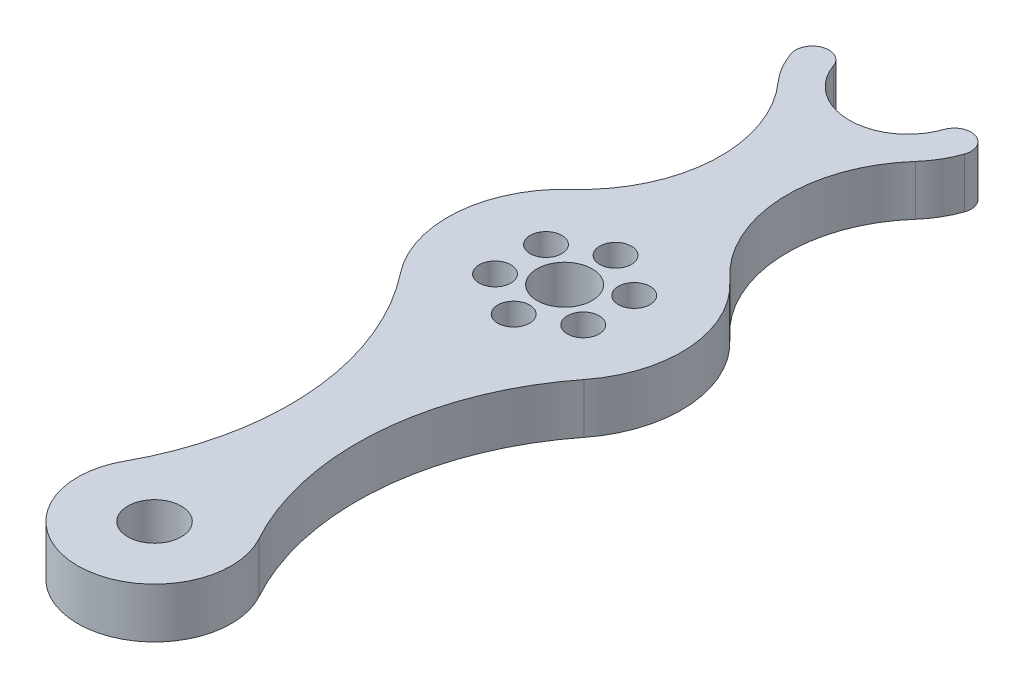
ISO-10303-21;
HEADER;
FILE_DESCRIPTION(('STEP AP214'),'2;1');
FILE_NAME('part.step','',(''),(''),'','','');
FILE_SCHEMA(('AUTOMOTIVE_DESIGN { 1 0 10303 214 1 1 1 1 }'));
ENDSEC;
DATA;
#1=APPLICATION_CONTEXT('core data for automotive mechanical design processes');
#2=APPLICATION_PROTOCOL_DEFINITION('international standard','automotive_design',2000,#1);
#3=PRODUCT_CONTEXT('',#1,'mechanical');
#4=PRODUCT('Part','Part','',(#3));
#5=PRODUCT_RELATED_PRODUCT_CATEGORY('part','',(#4));
#6=PRODUCT_DEFINITION_FORMATION('','',#4);
#7=PRODUCT_DEFINITION_CONTEXT('part definition',#1,'design');
#8=PRODUCT_DEFINITION('design','',#6,#7);
#9=PRODUCT_DEFINITION_SHAPE('','',#8);
#10=(LENGTH_UNIT() NAMED_UNIT(*) SI_UNIT(.MILLI.,.METRE.));
#11=(NAMED_UNIT(*) PLANE_ANGLE_UNIT() SI_UNIT($,.RADIAN.));
#12=(NAMED_UNIT(*) SI_UNIT($,.STERADIAN.) SOLID_ANGLE_UNIT());
#13=UNCERTAINTY_MEASURE_WITH_UNIT(LENGTH_MEASURE(1.E-05),#10,'distance_accuracy_value','');
#14=(GEOMETRIC_REPRESENTATION_CONTEXT(3) GLOBAL_UNCERTAINTY_ASSIGNED_CONTEXT((#13)) GLOBAL_UNIT_ASSIGNED_CONTEXT((#10,
#11,#12)) REPRESENTATION_CONTEXT('',''));
#15=CARTESIAN_POINT('',(0.,0.,0.));
#16=DIRECTION('',(0.,0.,1.));
#17=DIRECTION('',(1.,0.,0.));
#18=AXIS2_PLACEMENT_3D('',#15,#16,#17);
#19=CARTESIAN_POINT('',(0.,3.,68.5563909774436));
#20=DIRECTION('',(0.,-1.,0.));
#21=DIRECTION('',(0.,0.,-1.));
#22=AXIS2_PLACEMENT_3D('',#19,#20,#21);
#23=CYLINDRICAL_SURFACE('',#22,7.);
#24=DIRECTION('',(0.,-1.,0.));
#25=VECTOR('',#24,1.);
#26=CARTESIAN_POINT('',(-5.50113489588587,30.1491325608778,72.8850760961912));
#27=LINE('',#26,#25);
#28=CARTESIAN_POINT('',(-5.50113489588587,3.,72.8850760961912));
#29=VERTEX_POINT('',#28);
#30=CARTESIAN_POINT('',(-5.50113489588587,0.,72.8850760961912));
#31=VERTEX_POINT('',#30);
#32=EDGE_CURVE('E220',#29,#31,#27,.T.);
#33=ORIENTED_EDGE('',*,*,#32,.F.);
#34=CARTESIAN_POINT('',(0.,3.,68.5563909774436));
#35=DIRECTION('',(0.,1.,0.));
#36=DIRECTION('',(0.,0.,1.));
#37=AXIS2_PLACEMENT_3D('',#34,#35,#36);
#38=CIRCLE('',#37,7.);
#39=CARTESIAN_POINT('',(-4.7215870072062,3.,63.3885465396358));
#40=VERTEX_POINT('',#39);
#41=EDGE_CURVE('E98',#40,#29,#38,.T.);
#42=ORIENTED_EDGE('',*,*,#41,.F.);
#43=DIRECTION('',(0.,-1.,0.));
#44=VECTOR('',#43,1.);
#45=CARTESIAN_POINT('',(-4.7215870072062,3.,63.3885465396358));
#46=LINE('',#45,#44);
#47=CARTESIAN_POINT('',(-4.7215870072062,0.,63.3885465396358));
#48=VERTEX_POINT('',#47);
#49=EDGE_CURVE('E11',#40,#48,#46,.T.);
#50=ORIENTED_EDGE('',*,*,#49,.T.);
#51=CARTESIAN_POINT('',(0.,0.,68.5563909774436));
#52=DIRECTION('',(0.,1.,0.));
#53=DIRECTION('',(0.,0.,1.));
#54=AXIS2_PLACEMENT_3D('',#51,#52,#53);
#55=CIRCLE('',#54,7.);
#56=EDGE_CURVE('E149',#48,#31,#55,.T.);
#57=ORIENTED_EDGE('',*,*,#56,.T.);
#58=EDGE_LOOP('',(#33,#42,#50,#57));
#59=FACE_BOUND('',#58,.T.);
#60=ADVANCED_FACE('F33',(#59),#23,.T.);
#61=CARTESIAN_POINT('',(-5.18078485127556,3.,62.8859479386346));
#62=DIRECTION('',(0.,-1.,0.));
#63=DIRECTION('',(0.,0.,-1.));
#64=AXIS2_PLACEMENT_3D('',#61,#62,#63);
#65=PLANE('',#64);
#66=CARTESIAN_POINT('',(2.64137748154254,3.,67.0313909774436));
#67=DIRECTION('',(0.,1.,0.));
#68=DIRECTION('',(0.,0.,1.));
#69=AXIS2_PLACEMENT_3D('',#66,#67,#68);
#70=CIRCLE('',#69,0.950000000000002);
#71=CARTESIAN_POINT('',(2.64137748154254,3.,67.9813909774436));
#72=VERTEX_POINT('',#71);
#73=EDGE_CURVE('E266',#72,#72,#70,.T.);
#74=ORIENTED_EDGE('',*,*,#73,.F.);
#75=EDGE_LOOP('',(#74));
#76=FACE_BOUND('',#75,.T.);
#77=CARTESIAN_POINT('',(2.64137748154254,3.,70.0813909774436));
#78=DIRECTION('',(0.,1.,0.));
#79=DIRECTION('',(0.,0.,1.));
#80=AXIS2_PLACEMENT_3D('',#77,#78,#79);
#81=CIRCLE('',#80,0.950000000000002);
#82=CARTESIAN_POINT('',(2.64137748154254,3.,71.0313909774436));
#83=VERTEX_POINT('',#82);
#84=EDGE_CURVE('E260',#83,#83,#81,.T.);
#85=ORIENTED_EDGE('',*,*,#84,.F.);
#86=EDGE_LOOP('',(#85));
#87=FACE_BOUND('',#86,.T.);
#88=CARTESIAN_POINT('',(0.,3.,71.6063909774436));
#89=DIRECTION('',(0.,1.,0.));
#90=DIRECTION('',(0.,0.,1.));
#91=AXIS2_PLACEMENT_3D('',#88,#89,#90);
#92=CIRCLE('',#91,0.950000000000002);
#93=CARTESIAN_POINT('',(0.,3.,72.5563909774436));
#94=VERTEX_POINT('',#93);
#95=EDGE_CURVE('E254',#94,#94,#92,.T.);
#96=ORIENTED_EDGE('',*,*,#95,.F.);
#97=EDGE_LOOP('',(#96));
#98=FACE_BOUND('',#97,.T.);
#99=CARTESIAN_POINT('',(-2.64137748154254,3.,70.0813909774436));
#100=DIRECTION('',(0.,1.,0.));
#101=DIRECTION('',(0.,0.,1.));
#102=AXIS2_PLACEMENT_3D('',#99,#100,#101);
#103=CIRCLE('',#102,0.950000000000002);
#104=CARTESIAN_POINT('',(-2.64137748154254,3.,71.0313909774436));
#105=VERTEX_POINT('',#104);
#106=EDGE_CURVE('E247',#105,#105,#103,.T.);
#107=ORIENTED_EDGE('',*,*,#106,.F.);
#108=EDGE_LOOP('',(#107));
#109=FACE_BOUND('',#108,.T.);
#110=CARTESIAN_POINT('',(-2.64137748154254,3.,67.0313909774436));
#111=DIRECTION('',(0.,1.,0.));
#112=DIRECTION('',(0.,0.,1.));
#113=AXIS2_PLACEMENT_3D('',#110,#111,#112);
#114=CIRCLE('',#113,0.950000000000002);
#115=CARTESIAN_POINT('',(-2.64137748154254,3.,67.9813909774436));
#116=VERTEX_POINT('',#115);
#117=EDGE_CURVE('E271',#116,#116,#114,.T.);
#118=ORIENTED_EDGE('',*,*,#117,.F.);
#119=EDGE_LOOP('',(#118));
#120=FACE_BOUND('',#119,.T.);
#121=CARTESIAN_POINT('',(0.,3.,65.5063909774436));
#122=DIRECTION('',(0.,1.,0.));
#123=DIRECTION('',(0.,0.,1.));
#124=AXIS2_PLACEMENT_3D('',#121,#122,#123);
#125=CIRCLE('',#124,0.950000000000002);
#126=CARTESIAN_POINT('',(0.,3.,66.4563909774436));
#127=VERTEX_POINT('',#126);
#128=EDGE_CURVE('E241',#127,#127,#125,.T.);
#129=ORIENTED_EDGE('',*,*,#128,.F.);
#130=EDGE_LOOP('',(#129));
#131=FACE_BOUND('',#130,.T.);
#132=CARTESIAN_POINT('',(-10.3615697025511,3.,57.2155048998256));
#133=DIRECTION('',(0.,-1.,0.));
#134=DIRECTION('',(0.,0.,-1.));
#135=AXIS2_PLACEMENT_3D('',#132,#133,#134);
#136=CIRCLE('',#135,8.36156970255111);
#137=CARTESIAN_POINT('',(-4.11126839073232,3.,51.6612649516331));
#138=VERTEX_POINT('',#137);
#139=EDGE_CURVE('E162',#138,#40,#136,.T.);
#140=ORIENTED_EDGE('',*,*,#139,.T.);
#141=ORIENTED_EDGE('',*,*,#41,.T.);
#142=CARTESIAN_POINT('',(-18.3510006363685,3.,82.9962665435171));
#143=DIRECTION('',(0.,-1.,0.));
#144=DIRECTION('',(0.,0.,-1.));
#145=AXIS2_PLACEMENT_3D('',#142,#143,#144);
#146=CIRCLE('',#145,16.3510006363685);
#147=CARTESIAN_POINT('',(-4.02914421093384,3.,90.885477552215));
#148=VERTEX_POINT('',#147);
#149=EDGE_CURVE('E235',#29,#148,#146,.T.);
#150=ORIENTED_EDGE('',*,*,#149,.T.);
#151=CARTESIAN_POINT('',(0.,3.,93.1049362536777));
#152=DIRECTION('',(0.,-1.,0.));
#153=DIRECTION('',(0.,0.,-1.));
#154=AXIS2_PLACEMENT_3D('',#151,#152,#153);
#155=CIRCLE('',#154,4.60000000000001);
#156=CARTESIAN_POINT('',(4.02914421093384,3.,90.885477552215));
#157=VERTEX_POINT('',#156);
#158=EDGE_CURVE('E223',#148,#157,#155,.F.);
#159=ORIENTED_EDGE('',*,*,#158,.T.);
#160=CARTESIAN_POINT('',(18.3510006363685,3.,82.9962665435171));
#161=DIRECTION('',(0.,-1.,0.));
#162=DIRECTION('',(0.,0.,-1.));
#163=AXIS2_PLACEMENT_3D('',#160,#161,#162);
#164=CIRCLE('',#163,16.3510006363685);
#165=CARTESIAN_POINT('',(5.50113489588585,3.,72.8850760961912));
#166=VERTEX_POINT('',#165);
#167=EDGE_CURVE('E211',#157,#166,#164,.T.);
#168=ORIENTED_EDGE('',*,*,#167,.T.);
#169=CARTESIAN_POINT('',(4.7215870072062,3.,63.3885465396358));
#170=VERTEX_POINT('',#169);
#171=EDGE_CURVE('E201',#166,#170,#38,.T.);
#172=ORIENTED_EDGE('',*,*,#171,.T.);
#173=CARTESIAN_POINT('',(10.3615697025511,3.,57.2155048998256));
#174=DIRECTION('',(0.,-1.,0.));
#175=DIRECTION('',(0.,0.,1.));
#176=AXIS2_PLACEMENT_3D('',#173,#174,#175);
#177=CIRCLE('',#176,8.36156970255111);
#178=CARTESIAN_POINT('',(4.11126839073231,3.,51.6612649516331));
#179=VERTEX_POINT('',#178);
#180=EDGE_CURVE('E178',#170,#179,#177,.T.);
#181=ORIENTED_EDGE('',*,*,#180,.T.);
#182=CARTESIAN_POINT('',(0.,3.,48.0078457012096));
#183=DIRECTION('',(0.,1.,0.));
#184=DIRECTION('',(0.,0.,-1.));
#185=AXIS2_PLACEMENT_3D('',#182,#183,#184);
#186=CIRCLE('',#185,5.50000000000001);
#187=CARTESIAN_POINT('',(5.1989420962775,3.,49.8025604639375));
#188=VERTEX_POINT('',#187);
#189=EDGE_CURVE('E196',#179,#188,#186,.T.);
#190=ORIENTED_EDGE('',*,*,#189,.T.);
#191=CARTESIAN_POINT('',(4.25367989695432,3.,49.4762486888961));
#192=DIRECTION('',(0.,1.,0.));
#193=DIRECTION('',(0.,0.,1.));
#194=AXIS2_PLACEMENT_3D('',#191,#192,#193);
#195=CIRCLE('',#194,0.999999999999998);
#196=CARTESIAN_POINT('',(3.30841769763114,3.,49.1499369138546));
#197=VERTEX_POINT('',#196);
#198=EDGE_CURVE('E123',#188,#197,#195,.T.);
#199=ORIENTED_EDGE('',*,*,#198,.T.);
#200=CARTESIAN_POINT('',(0.,3.,48.0078457012096));
#201=DIRECTION('',(0.,-1.,0.));
#202=DIRECTION('',(0.,0.,1.));
#203=AXIS2_PLACEMENT_3D('',#200,#201,#202);
#204=CIRCLE('',#203,3.50000000000001);
#205=CARTESIAN_POINT('',(-3.30841769763114,3.,49.1499369138546));
#206=VERTEX_POINT('',#205);
#207=EDGE_CURVE('E115',#197,#206,#204,.T.);
#208=ORIENTED_EDGE('',*,*,#207,.T.);
#209=CARTESIAN_POINT('',(-4.25367989695432,3.,49.4762486888961));
#210=DIRECTION('',(0.,1.,0.));
#211=DIRECTION('',(0.,0.,-1.));
#212=AXIS2_PLACEMENT_3D('',#209,#210,#211);
#213=CIRCLE('',#212,0.999999999999998);
#214=CARTESIAN_POINT('',(-5.1989420962775,3.,49.8025604639375));
#215=VERTEX_POINT('',#214);
#216=EDGE_CURVE('E120',#206,#215,#213,.T.);
#217=ORIENTED_EDGE('',*,*,#216,.T.);
#218=CARTESIAN_POINT('',(0.,3.,48.0078457012096));
#219=DIRECTION('',(0.,1.,0.));
#220=DIRECTION('',(0.,0.,1.));
#221=AXIS2_PLACEMENT_3D('',#218,#219,#220);
#222=CIRCLE('',#221,5.50000000000001);
#223=EDGE_CURVE('E57',#215,#138,#222,.T.);
#224=ORIENTED_EDGE('',*,*,#223,.T.);
#225=EDGE_LOOP('',(#140,#141,#150,#159,#168,#172,#181,#190,#199,#208,#217,#224));
#226=FACE_BOUND('',#225,.T.);
#227=CARTESIAN_POINT('',(0.,3.,68.5563909774436));
#228=DIRECTION('',(0.,1.,0.));
#229=DIRECTION('',(0.,0.,1.));
#230=AXIS2_PLACEMENT_3D('',#227,#228,#229);
#231=CIRCLE('',#230,1.65);
#232=CARTESIAN_POINT('',(0.,3.,70.2063909774436));
#233=VERTEX_POINT('',#232);
#234=EDGE_CURVE('E148',#233,#233,#231,.T.);
#235=ORIENTED_EDGE('',*,*,#234,.F.);
#236=EDGE_LOOP('',(#235));
#237=FACE_BOUND('',#236,.T.);
#238=CARTESIAN_POINT('',(0.,3.,93.1049362536777));
#239=DIRECTION('',(0.,-1.,0.));
#240=DIRECTION('',(0.,0.,-1.));
#241=AXIS2_PLACEMENT_3D('',#238,#239,#240);
#242=CIRCLE('',#241,1.6);
#243=CARTESIAN_POINT('',(0.,3.,91.5049362536777));
#244=VERTEX_POINT('',#243);
#245=EDGE_CURVE('E206',#244,#244,#242,.F.);
#246=ORIENTED_EDGE('',*,*,#245,.F.);
#247=EDGE_LOOP('',(#246));
#248=FACE_BOUND('',#247,.T.);
#249=ADVANCED_FACE('F117',(#76,#87,#98,#109,#120,#131,#226,#237,#248),#65,.F.);
#250=CARTESIAN_POINT('',(-5.18078485127556,0.,62.8859479386346));
#251=DIRECTION('',(0.,-1.,0.));
#252=DIRECTION('',(0.,0.,-1.));
#253=AXIS2_PLACEMENT_3D('',#250,#251,#252);
#254=PLANE('',#253);
#255=CARTESIAN_POINT('',(2.64137748154254,0.,67.0313909774436));
#256=DIRECTION('',(0.,1.,0.));
#257=DIRECTION('',(0.,0.,1.));
#258=AXIS2_PLACEMENT_3D('',#255,#256,#257);
#259=CIRCLE('',#258,0.950000000000002);
#260=CARTESIAN_POINT('',(2.64137748154254,0.,67.9813909774436));
#261=VERTEX_POINT('',#260);
#262=EDGE_CURVE('E244',#261,#261,#259,.T.);
#263=ORIENTED_EDGE('',*,*,#262,.T.);
#264=EDGE_LOOP('',(#263));
#265=FACE_BOUND('',#264,.T.);
#266=CARTESIAN_POINT('',(2.64137748154254,0.,70.0813909774436));
#267=DIRECTION('',(0.,1.,0.));
#268=DIRECTION('',(0.,0.,1.));
#269=AXIS2_PLACEMENT_3D('',#266,#267,#268);
#270=CIRCLE('',#269,0.950000000000002);
#271=CARTESIAN_POINT('',(2.64137748154254,0.,71.0313909774436));
#272=VERTEX_POINT('',#271);
#273=EDGE_CURVE('E263',#272,#272,#270,.T.);
#274=ORIENTED_EDGE('',*,*,#273,.T.);
#275=EDGE_LOOP('',(#274));
#276=FACE_BOUND('',#275,.T.);
#277=CARTESIAN_POINT('',(0.,0.,71.6063909774436));
#278=DIRECTION('',(0.,1.,0.));
#279=DIRECTION('',(0.,0.,1.));
#280=AXIS2_PLACEMENT_3D('',#277,#278,#279);
#281=CIRCLE('',#280,0.950000000000002);
#282=CARTESIAN_POINT('',(0.,0.,72.5563909774436));
#283=VERTEX_POINT('',#282);
#284=EDGE_CURVE('E257',#283,#283,#281,.T.);
#285=ORIENTED_EDGE('',*,*,#284,.T.);
#286=EDGE_LOOP('',(#285));
#287=FACE_BOUND('',#286,.T.);
#288=CARTESIAN_POINT('',(-2.64137748154254,0.,70.0813909774436));
#289=DIRECTION('',(0.,1.,0.));
#290=DIRECTION('',(0.,0.,1.));
#291=AXIS2_PLACEMENT_3D('',#288,#289,#290);
#292=CIRCLE('',#291,0.950000000000002);
#293=CARTESIAN_POINT('',(-2.64137748154254,0.,71.0313909774436));
#294=VERTEX_POINT('',#293);
#295=EDGE_CURVE('E250',#294,#294,#292,.T.);
#296=ORIENTED_EDGE('',*,*,#295,.T.);
#297=EDGE_LOOP('',(#296));
#298=FACE_BOUND('',#297,.T.);
#299=CARTESIAN_POINT('',(-2.64137748154254,0.,67.0313909774436));
#300=DIRECTION('',(0.,1.,0.));
#301=DIRECTION('',(0.,0.,1.));
#302=AXIS2_PLACEMENT_3D('',#299,#300,#301);
#303=CIRCLE('',#302,0.950000000000002);
#304=CARTESIAN_POINT('',(-2.64137748154254,0.,67.9813909774436));
#305=VERTEX_POINT('',#304);
#306=EDGE_CURVE('E251',#305,#305,#303,.T.);
#307=ORIENTED_EDGE('',*,*,#306,.T.);
#308=EDGE_LOOP('',(#307));
#309=FACE_BOUND('',#308,.T.);
#310=CARTESIAN_POINT('',(0.,0.,65.5063909774436));
#311=DIRECTION('',(0.,1.,0.));
#312=DIRECTION('',(0.,0.,1.));
#313=AXIS2_PLACEMENT_3D('',#310,#311,#312);
#314=CIRCLE('',#313,0.950000000000002);
#315=CARTESIAN_POINT('',(0.,0.,66.4563909774436));
#316=VERTEX_POINT('',#315);
#317=EDGE_CURVE('E234',#316,#316,#314,.T.);
#318=ORIENTED_EDGE('',*,*,#317,.T.);
#319=EDGE_LOOP('',(#318));
#320=FACE_BOUND('',#319,.T.);
#321=CARTESIAN_POINT('',(-10.3615697025511,0.,57.2155048998256));
#322=DIRECTION('',(0.,-1.,0.));
#323=DIRECTION('',(0.,0.,-1.));
#324=AXIS2_PLACEMENT_3D('',#321,#322,#323);
#325=CIRCLE('',#324,8.36156970255111);
#326=CARTESIAN_POINT('',(-4.11126839073232,0.,51.6612649516331));
#327=VERTEX_POINT('',#326);
#328=EDGE_CURVE('E144',#327,#48,#325,.T.);
#329=ORIENTED_EDGE('',*,*,#328,.F.);
#330=CARTESIAN_POINT('',(0.,0.,48.0078457012096));
#331=DIRECTION('',(0.,1.,0.));
#332=DIRECTION('',(0.,0.,1.));
#333=AXIS2_PLACEMENT_3D('',#330,#331,#332);
#334=CIRCLE('',#333,5.50000000000001);
#335=CARTESIAN_POINT('',(-5.1989420962775,0.,49.8025604639375));
#336=VERTEX_POINT('',#335);
#337=EDGE_CURVE('E90',#336,#327,#334,.T.);
#338=ORIENTED_EDGE('',*,*,#337,.F.);
#339=CARTESIAN_POINT('',(-4.25367989695432,0.,49.4762486888961));
#340=DIRECTION('',(0.,1.,0.));
#341=DIRECTION('',(0.,0.,-1.));
#342=AXIS2_PLACEMENT_3D('',#339,#340,#341);
#343=CIRCLE('',#342,0.999999999999998);
#344=CARTESIAN_POINT('',(-3.30841769763114,0.,49.1499369138546));
#345=VERTEX_POINT('',#344);
#346=EDGE_CURVE('E159',#345,#336,#343,.T.);
#347=ORIENTED_EDGE('',*,*,#346,.F.);
#348=CARTESIAN_POINT('',(0.,0.,48.0078457012096));
#349=DIRECTION('',(0.,-1.,0.));
#350=DIRECTION('',(0.,0.,1.));
#351=AXIS2_PLACEMENT_3D('',#348,#349,#350);
#352=CIRCLE('',#351,3.50000000000001);
#353=CARTESIAN_POINT('',(3.30841769763114,0.,49.1499369138546));
#354=VERTEX_POINT('',#353);
#355=EDGE_CURVE('E132',#354,#345,#352,.T.);
#356=ORIENTED_EDGE('',*,*,#355,.F.);
#357=CARTESIAN_POINT('',(4.25367989695432,0.,49.4762486888961));
#358=DIRECTION('',(0.,1.,0.));
#359=DIRECTION('',(0.,0.,1.));
#360=AXIS2_PLACEMENT_3D('',#357,#358,#359);
#361=CIRCLE('',#360,0.999999999999998);
#362=CARTESIAN_POINT('',(5.1989420962775,0.,49.8025604639375));
#363=VERTEX_POINT('',#362);
#364=EDGE_CURVE('E156',#363,#354,#361,.T.);
#365=ORIENTED_EDGE('',*,*,#364,.F.);
#366=CARTESIAN_POINT('',(0.,0.,48.0078457012096));
#367=DIRECTION('',(0.,1.,0.));
#368=DIRECTION('',(0.,0.,-1.));
#369=AXIS2_PLACEMENT_3D('',#366,#367,#368);
#370=CIRCLE('',#369,5.50000000000001);
#371=CARTESIAN_POINT('',(4.11126839073231,0.,51.6612649516331));
#372=VERTEX_POINT('',#371);
#373=EDGE_CURVE('E154',#372,#363,#370,.T.);
#374=ORIENTED_EDGE('',*,*,#373,.F.);
#375=CARTESIAN_POINT('',(10.3615697025511,0.,57.2155048998256));
#376=DIRECTION('',(0.,-1.,0.));
#377=DIRECTION('',(0.,0.,1.));
#378=AXIS2_PLACEMENT_3D('',#375,#376,#377);
#379=CIRCLE('',#378,8.36156970255111);
#380=CARTESIAN_POINT('',(4.7215870072062,0.,63.3885465396358));
#381=VERTEX_POINT('',#380);
#382=EDGE_CURVE('E152',#381,#372,#379,.T.);
#383=ORIENTED_EDGE('',*,*,#382,.F.);
#384=CARTESIAN_POINT('',(5.50113489588586,0.,72.8850760961912));
#385=VERTEX_POINT('',#384);
#386=EDGE_CURVE('E147',#385,#381,#55,.T.);
#387=ORIENTED_EDGE('',*,*,#386,.F.);
#388=CARTESIAN_POINT('',(18.3510006363685,0.,82.9962665435171));
#389=DIRECTION('',(0.,1.,0.));
#390=DIRECTION('',(0.,0.,-1.));
#391=AXIS2_PLACEMENT_3D('',#388,#389,#390);
#392=CIRCLE('',#391,16.3510006363685);
#393=CARTESIAN_POINT('',(4.02914421093384,0.,90.885477552215));
#394=VERTEX_POINT('',#393);
#395=EDGE_CURVE('E229',#385,#394,#392,.T.);
#396=ORIENTED_EDGE('',*,*,#395,.T.);
#397=CARTESIAN_POINT('',(0.,0.,93.1049362536777));
#398=DIRECTION('',(0.,-1.,0.));
#399=DIRECTION('',(0.,0.,1.));
#400=AXIS2_PLACEMENT_3D('',#397,#398,#399);
#401=CIRCLE('',#400,4.60000000000001);
#402=CARTESIAN_POINT('',(-4.02914421093383,0.,90.885477552215));
#403=VERTEX_POINT('',#402);
#404=EDGE_CURVE('E226',#394,#403,#401,.T.);
#405=ORIENTED_EDGE('',*,*,#404,.T.);
#406=CARTESIAN_POINT('',(-18.3510006363685,0.,82.9962665435171));
#407=DIRECTION('',(0.,1.,0.));
#408=DIRECTION('',(0.,0.,1.));
#409=AXIS2_PLACEMENT_3D('',#406,#407,#408);
#410=CIRCLE('',#409,16.3510006363685);
#411=EDGE_CURVE('E214',#403,#31,#410,.T.);
#412=ORIENTED_EDGE('',*,*,#411,.T.);
#413=ORIENTED_EDGE('',*,*,#56,.F.);
#414=EDGE_LOOP('',(#329,#338,#347,#356,#365,#374,#383,#387,#396,#405,#412,#413));
#415=FACE_BOUND('',#414,.T.);
#416=CARTESIAN_POINT('',(0.,0.,68.5563909774436));
#417=DIRECTION('',(0.,1.,0.));
#418=DIRECTION('',(0.,0.,1.));
#419=AXIS2_PLACEMENT_3D('',#416,#417,#418);
#420=CIRCLE('',#419,1.65);
#421=CARTESIAN_POINT('',(0.,0.,70.2063909774436));
#422=VERTEX_POINT('',#421);
#423=EDGE_CURVE('E203',#422,#422,#420,.T.);
#424=ORIENTED_EDGE('',*,*,#423,.T.);
#425=EDGE_LOOP('',(#424));
#426=FACE_BOUND('',#425,.T.);
#427=CARTESIAN_POINT('',(0.,0.,93.1049362536777));
#428=DIRECTION('',(0.,-1.,0.));
#429=DIRECTION('',(0.,0.,-1.));
#430=AXIS2_PLACEMENT_3D('',#427,#428,#429);
#431=CIRCLE('',#430,1.6);
#432=CARTESIAN_POINT('',(0.,0.,91.5049362536777));
#433=VERTEX_POINT('',#432);
#434=EDGE_CURVE('E231',#433,#433,#431,.T.);
#435=ORIENTED_EDGE('',*,*,#434,.F.);
#436=EDGE_LOOP('',(#435));
#437=FACE_BOUND('',#436,.T.);
#438=ADVANCED_FACE('F185',(#265,#276,#287,#298,#309,#320,#415,#426,#437),#254,.T.);
#439=CARTESIAN_POINT('',(-10.3615697025511,3.,57.2155048998256));
#440=DIRECTION('',(0.,-1.,0.));
#441=DIRECTION('',(0.,0.,-1.));
#442=AXIS2_PLACEMENT_3D('',#439,#440,#441);
#443=CYLINDRICAL_SURFACE('',#442,8.36156970255111);
#444=ORIENTED_EDGE('',*,*,#328,.T.);
#445=ORIENTED_EDGE('',*,*,#49,.F.);
#446=ORIENTED_EDGE('',*,*,#139,.F.);
#447=DIRECTION('',(0.,-1.,0.));
#448=VECTOR('',#447,1.);
#449=CARTESIAN_POINT('',(-4.11126839073232,3.,51.6612649516331));
#450=LINE('',#449,#448);
#451=EDGE_CURVE('E140',#138,#327,#450,.T.);
#452=ORIENTED_EDGE('',*,*,#451,.T.);
#453=EDGE_LOOP('',(#444,#445,#446,#452));
#454=FACE_BOUND('',#453,.T.);
#455=ADVANCED_FACE('F35',(#454),#443,.F.);
#456=ORIENTED_EDGE('',*,*,#171,.F.);
#457=DIRECTION('',(0.,-1.,0.));
#458=VECTOR('',#457,1.);
#459=CARTESIAN_POINT('',(5.50113489588586,30.1491325608778,72.8850760961912));
#460=LINE('',#459,#458);
#461=EDGE_CURVE('E48',#166,#385,#460,.T.);
#462=ORIENTED_EDGE('',*,*,#461,.T.);
#463=ORIENTED_EDGE('',*,*,#386,.T.);
#464=DIRECTION('',(0.,-1.,0.));
#465=VECTOR('',#464,1.);
#466=CARTESIAN_POINT('',(4.7215870072062,3.,63.3885465396358));
#467=LINE('',#466,#465);
#468=EDGE_CURVE('E41',#170,#381,#467,.T.);
#469=ORIENTED_EDGE('',*,*,#468,.F.);
#470=EDGE_LOOP('',(#456,#462,#463,#469));
#471=FACE_BOUND('',#470,.T.);
#472=ADVANCED_FACE('F306',(#471),#23,.T.);
#473=CARTESIAN_POINT('',(10.3615697025511,3.,57.2155048998256));
#474=DIRECTION('',(0.,-1.,0.));
#475=DIRECTION('',(0.,0.,-1.));
#476=AXIS2_PLACEMENT_3D('',#473,#474,#475);
#477=CYLINDRICAL_SURFACE('',#476,8.36156970255111);
#478=ORIENTED_EDGE('',*,*,#382,.T.);
#479=DIRECTION('',(0.,-1.,0.));
#480=VECTOR('',#479,1.);
#481=CARTESIAN_POINT('',(4.11126839073231,3.,51.6612649516331));
#482=LINE('',#481,#480);
#483=EDGE_CURVE('E169',#179,#372,#482,.T.);
#484=ORIENTED_EDGE('',*,*,#483,.F.);
#485=ORIENTED_EDGE('',*,*,#180,.F.);
#486=ORIENTED_EDGE('',*,*,#468,.T.);
#487=EDGE_LOOP('',(#478,#484,#485,#486));
#488=FACE_BOUND('',#487,.T.);
#489=ADVANCED_FACE('F176',(#488),#477,.F.);
#490=CARTESIAN_POINT('',(0.,3.,48.0078457012096));
#491=DIRECTION('',(0.,-1.,0.));
#492=DIRECTION('',(0.,0.,-1.));
#493=AXIS2_PLACEMENT_3D('',#490,#491,#492);
#494=CYLINDRICAL_SURFACE('',#493,5.50000000000001);
#495=ORIENTED_EDGE('',*,*,#373,.T.);
#496=DIRECTION('',(0.,-1.,0.));
#497=VECTOR('',#496,1.);
#498=CARTESIAN_POINT('',(5.1989420962775,3.,49.8025604639375));
#499=LINE('',#498,#497);
#500=EDGE_CURVE('E166',#188,#363,#499,.T.);
#501=ORIENTED_EDGE('',*,*,#500,.F.);
#502=ORIENTED_EDGE('',*,*,#189,.F.);
#503=ORIENTED_EDGE('',*,*,#483,.T.);
#504=EDGE_LOOP('',(#495,#501,#502,#503));
#505=FACE_BOUND('',#504,.T.);
#506=ADVANCED_FACE('F192',(#505),#494,.T.);
#507=CARTESIAN_POINT('',(4.25367989695432,3.,49.4762486888961));
#508=DIRECTION('',(0.,-1.,0.));
#509=DIRECTION('',(0.,0.,-1.));
#510=AXIS2_PLACEMENT_3D('',#507,#508,#509);
#511=CYLINDRICAL_SURFACE('',#510,0.999999999999998);
#512=ORIENTED_EDGE('',*,*,#364,.T.);
#513=DIRECTION('',(0.,-1.,0.));
#514=VECTOR('',#513,1.);
#515=CARTESIAN_POINT('',(3.30841769763114,3.,49.1499369138546));
#516=LINE('',#515,#514);
#517=EDGE_CURVE('E135',#197,#354,#516,.T.);
#518=ORIENTED_EDGE('',*,*,#517,.F.);
#519=ORIENTED_EDGE('',*,*,#198,.F.);
#520=ORIENTED_EDGE('',*,*,#500,.T.);
#521=EDGE_LOOP('',(#512,#518,#519,#520));
#522=FACE_BOUND('',#521,.T.);
#523=ADVANCED_FACE('F195',(#522),#511,.T.);
#524=CARTESIAN_POINT('',(0.,3.,48.0078457012096));
#525=DIRECTION('',(0.,-1.,0.));
#526=DIRECTION('',(0.,0.,-1.));
#527=AXIS2_PLACEMENT_3D('',#524,#525,#526);
#528=CYLINDRICAL_SURFACE('',#527,3.50000000000001);
#529=ORIENTED_EDGE('',*,*,#355,.T.);
#530=DIRECTION('',(0.,-1.,0.));
#531=VECTOR('',#530,1.);
#532=CARTESIAN_POINT('',(-3.30841769763114,3.,49.1499369138546));
#533=LINE('',#532,#531);
#534=EDGE_CURVE('E129',#206,#345,#533,.T.);
#535=ORIENTED_EDGE('',*,*,#534,.F.);
#536=ORIENTED_EDGE('',*,*,#207,.F.);
#537=ORIENTED_EDGE('',*,*,#517,.T.);
#538=EDGE_LOOP('',(#529,#535,#536,#537));
#539=FACE_BOUND('',#538,.T.);
#540=ADVANCED_FACE('F130',(#539),#528,.F.);
#541=CARTESIAN_POINT('',(-4.25367989695432,3.,49.4762486888961));
#542=DIRECTION('',(0.,-1.,0.));
#543=DIRECTION('',(0.,0.,-1.));
#544=AXIS2_PLACEMENT_3D('',#541,#542,#543);
#545=CYLINDRICAL_SURFACE('',#544,0.999999999999998);
#546=ORIENTED_EDGE('',*,*,#346,.T.);
#547=DIRECTION('',(0.,-1.,0.));
#548=VECTOR('',#547,1.);
#549=CARTESIAN_POINT('',(-5.1989420962775,3.,49.8025604639375));
#550=LINE('',#549,#548);
#551=EDGE_CURVE('E136',#215,#336,#550,.T.);
#552=ORIENTED_EDGE('',*,*,#551,.F.);
#553=ORIENTED_EDGE('',*,*,#216,.F.);
#554=ORIENTED_EDGE('',*,*,#534,.T.);
#555=EDGE_LOOP('',(#546,#552,#553,#554));
#556=FACE_BOUND('',#555,.T.);
#557=ADVANCED_FACE('F138',(#556),#545,.T.);
#558=CARTESIAN_POINT('',(0.,3.,48.0078457012096));
#559=DIRECTION('',(0.,-1.,0.));
#560=DIRECTION('',(0.,0.,-1.));
#561=AXIS2_PLACEMENT_3D('',#558,#559,#560);
#562=CYLINDRICAL_SURFACE('',#561,5.50000000000001);
#563=ORIENTED_EDGE('',*,*,#337,.T.);
#564=ORIENTED_EDGE('',*,*,#451,.F.);
#565=ORIENTED_EDGE('',*,*,#223,.F.);
#566=ORIENTED_EDGE('',*,*,#551,.T.);
#567=EDGE_LOOP('',(#563,#564,#565,#566));
#568=FACE_BOUND('',#567,.T.);
#569=ADVANCED_FACE('F348',(#568),#562,.T.);
#570=CARTESIAN_POINT('',(0.,3.,68.5563909774436));
#571=DIRECTION('',(0.,-1.,0.));
#572=DIRECTION('',(0.,0.,-1.));
#573=AXIS2_PLACEMENT_3D('',#570,#571,#572);
#574=CYLINDRICAL_SURFACE('',#573,1.65);
#575=ORIENTED_EDGE('',*,*,#234,.T.);
#576=EDGE_LOOP('',(#575));
#577=FACE_BOUND('',#576,.T.);
#578=ORIENTED_EDGE('',*,*,#423,.F.);
#579=EDGE_LOOP('',(#578));
#580=FACE_BOUND('',#579,.T.);
#581=ADVANCED_FACE('F344',(#577,#580),#574,.F.);
#582=CARTESIAN_POINT('',(18.3510006363685,30.1491325608778,82.9962665435171));
#583=DIRECTION('',(0.,-1.,0.));
#584=DIRECTION('',(0.,0.,-1.));
#585=AXIS2_PLACEMENT_3D('',#582,#583,#584);
#586=CYLINDRICAL_SURFACE('',#585,16.3510006363685);
#587=ORIENTED_EDGE('',*,*,#167,.F.);
#588=DIRECTION('',(0.,-1.,0.));
#589=VECTOR('',#588,1.);
#590=CARTESIAN_POINT('',(4.02914421093384,30.1491325608778,90.885477552215));
#591=LINE('',#590,#589);
#592=EDGE_CURVE('E213',#157,#394,#591,.T.);
#593=ORIENTED_EDGE('',*,*,#592,.T.);
#594=ORIENTED_EDGE('',*,*,#395,.F.);
#595=ORIENTED_EDGE('',*,*,#461,.F.);
#596=EDGE_LOOP('',(#587,#593,#594,#595));
#597=FACE_BOUND('',#596,.T.);
#598=ADVANCED_FACE('F319',(#597),#586,.F.);
#599=CARTESIAN_POINT('',(0.,30.1491325608778,93.1049362536777));
#600=DIRECTION('',(0.,-1.,0.));
#601=DIRECTION('',(0.,0.,-1.));
#602=AXIS2_PLACEMENT_3D('',#599,#600,#601);
#603=CYLINDRICAL_SURFACE('',#602,4.60000000000001);
#604=ORIENTED_EDGE('',*,*,#158,.F.);
#605=DIRECTION('',(0.,-1.,0.));
#606=VECTOR('',#605,1.);
#607=CARTESIAN_POINT('',(-4.02914421093383,30.1491325608778,90.885477552215));
#608=LINE('',#607,#606);
#609=EDGE_CURVE('E217',#148,#403,#608,.T.);
#610=ORIENTED_EDGE('',*,*,#609,.T.);
#611=ORIENTED_EDGE('',*,*,#404,.F.);
#612=ORIENTED_EDGE('',*,*,#592,.F.);
#613=EDGE_LOOP('',(#604,#610,#611,#612));
#614=FACE_BOUND('',#613,.T.);
#615=ADVANCED_FACE('F336',(#614),#603,.T.);
#616=CARTESIAN_POINT('',(-18.3510006363685,30.1491325608778,82.9962665435171));
#617=DIRECTION('',(0.,-1.,0.));
#618=DIRECTION('',(0.,0.,-1.));
#619=AXIS2_PLACEMENT_3D('',#616,#617,#618);
#620=CYLINDRICAL_SURFACE('',#619,16.3510006363685);
#621=ORIENTED_EDGE('',*,*,#149,.F.);
#622=ORIENTED_EDGE('',*,*,#32,.T.);
#623=ORIENTED_EDGE('',*,*,#411,.F.);
#624=ORIENTED_EDGE('',*,*,#609,.F.);
#625=EDGE_LOOP('',(#621,#622,#623,#624));
#626=FACE_BOUND('',#625,.T.);
#627=ADVANCED_FACE('F300',(#626),#620,.F.);
#628=CARTESIAN_POINT('',(0.,30.1491325608778,93.1049362536777));
#629=DIRECTION('',(0.,-1.,0.));
#630=DIRECTION('',(0.,0.,-1.));
#631=AXIS2_PLACEMENT_3D('',#628,#629,#630);
#632=CYLINDRICAL_SURFACE('',#631,1.6);
#633=ORIENTED_EDGE('',*,*,#245,.T.);
#634=EDGE_LOOP('',(#633));
#635=FACE_BOUND('',#634,.T.);
#636=ORIENTED_EDGE('',*,*,#434,.T.);
#637=EDGE_LOOP('',(#636));
#638=FACE_BOUND('',#637,.T.);
#639=ADVANCED_FACE('F294',(#635,#638),#632,.F.);
#640=CARTESIAN_POINT('',(0.,0.,65.5063909774436));
#641=DIRECTION('',(0.,1.,0.));
#642=DIRECTION('',(0.,0.,1.));
#643=AXIS2_PLACEMENT_3D('',#640,#641,#642);
#644=CYLINDRICAL_SURFACE('',#643,0.950000000000002);
#645=ORIENTED_EDGE('',*,*,#317,.F.);
#646=EDGE_LOOP('',(#645));
#647=FACE_BOUND('',#646,.T.);
#648=ORIENTED_EDGE('',*,*,#128,.T.);
#649=EDGE_LOOP('',(#648));
#650=FACE_BOUND('',#649,.T.);
#651=ADVANCED_FACE('F283',(#647,#650),#644,.F.);
#652=CARTESIAN_POINT('',(-2.64137748154254,0.,67.0313909774436));
#653=DIRECTION('',(0.,1.,0.));
#654=DIRECTION('',(0.,0.,1.));
#655=AXIS2_PLACEMENT_3D('',#652,#653,#654);
#656=CYLINDRICAL_SURFACE('',#655,0.950000000000002);
#657=ORIENTED_EDGE('',*,*,#306,.F.);
#658=EDGE_LOOP('',(#657));
#659=FACE_BOUND('',#658,.T.);
#660=ORIENTED_EDGE('',*,*,#117,.T.);
#661=EDGE_LOOP('',(#660));
#662=FACE_BOUND('',#661,.T.);
#663=ADVANCED_FACE('F279',(#659,#662),#656,.F.);
#664=CARTESIAN_POINT('',(-2.64137748154254,0.,70.0813909774436));
#665=DIRECTION('',(0.,1.,0.));
#666=DIRECTION('',(0.,0.,1.));
#667=AXIS2_PLACEMENT_3D('',#664,#665,#666);
#668=CYLINDRICAL_SURFACE('',#667,0.950000000000002);
#669=ORIENTED_EDGE('',*,*,#295,.F.);
#670=EDGE_LOOP('',(#669));
#671=FACE_BOUND('',#670,.T.);
#672=ORIENTED_EDGE('',*,*,#106,.T.);
#673=EDGE_LOOP('',(#672));
#674=FACE_BOUND('',#673,.T.);
#675=ADVANCED_FACE('F282',(#671,#674),#668,.F.);
#676=CARTESIAN_POINT('',(0.,0.,71.6063909774436));
#677=DIRECTION('',(0.,1.,0.));
#678=DIRECTION('',(0.,0.,1.));
#679=AXIS2_PLACEMENT_3D('',#676,#677,#678);
#680=CYLINDRICAL_SURFACE('',#679,0.950000000000002);
#681=ORIENTED_EDGE('',*,*,#284,.F.);
#682=EDGE_LOOP('',(#681));
#683=FACE_BOUND('',#682,.T.);
#684=ORIENTED_EDGE('',*,*,#95,.T.);
#685=EDGE_LOOP('',(#684));
#686=FACE_BOUND('',#685,.T.);
#687=ADVANCED_FACE('F443',(#683,#686),#680,.F.);
#688=CARTESIAN_POINT('',(2.64137748154254,0.,70.0813909774436));
#689=DIRECTION('',(0.,1.,0.));
#690=DIRECTION('',(0.,0.,1.));
#691=AXIS2_PLACEMENT_3D('',#688,#689,#690);
#692=CYLINDRICAL_SURFACE('',#691,0.950000000000002);
#693=ORIENTED_EDGE('',*,*,#273,.F.);
#694=EDGE_LOOP('',(#693));
#695=FACE_BOUND('',#694,.T.);
#696=ORIENTED_EDGE('',*,*,#84,.T.);
#697=EDGE_LOOP('',(#696));
#698=FACE_BOUND('',#697,.T.);
#699=ADVANCED_FACE('F452',(#695,#698),#692,.F.);
#700=CARTESIAN_POINT('',(2.64137748154254,0.,67.0313909774436));
#701=DIRECTION('',(0.,1.,0.));
#702=DIRECTION('',(0.,0.,1.));
#703=AXIS2_PLACEMENT_3D('',#700,#701,#702);
#704=CYLINDRICAL_SURFACE('',#703,0.950000000000002);
#705=ORIENTED_EDGE('',*,*,#262,.F.);
#706=EDGE_LOOP('',(#705));
#707=FACE_BOUND('',#706,.T.);
#708=ORIENTED_EDGE('',*,*,#73,.T.);
#709=EDGE_LOOP('',(#708));
#710=FACE_BOUND('',#709,.T.);
#711=ADVANCED_FACE('F462',(#707,#710),#704,.F.);
#712=CLOSED_SHELL('',(#60,#249,#438,#455,#472,#489,#506,#523,#540,#557,#569,#581,#598,#615,#627,
#639,#651,#663,#675,#687,#699,#711));
#713=MANIFOLD_SOLID_BREP('B2',#712);
#714=ADVANCED_BREP_SHAPE_REPRESENTATION('',(#18,#713),#14);
#715=SHAPE_DEFINITION_REPRESENTATION(#9,#714);
ENDSEC;
END-ISO-10303-21;
